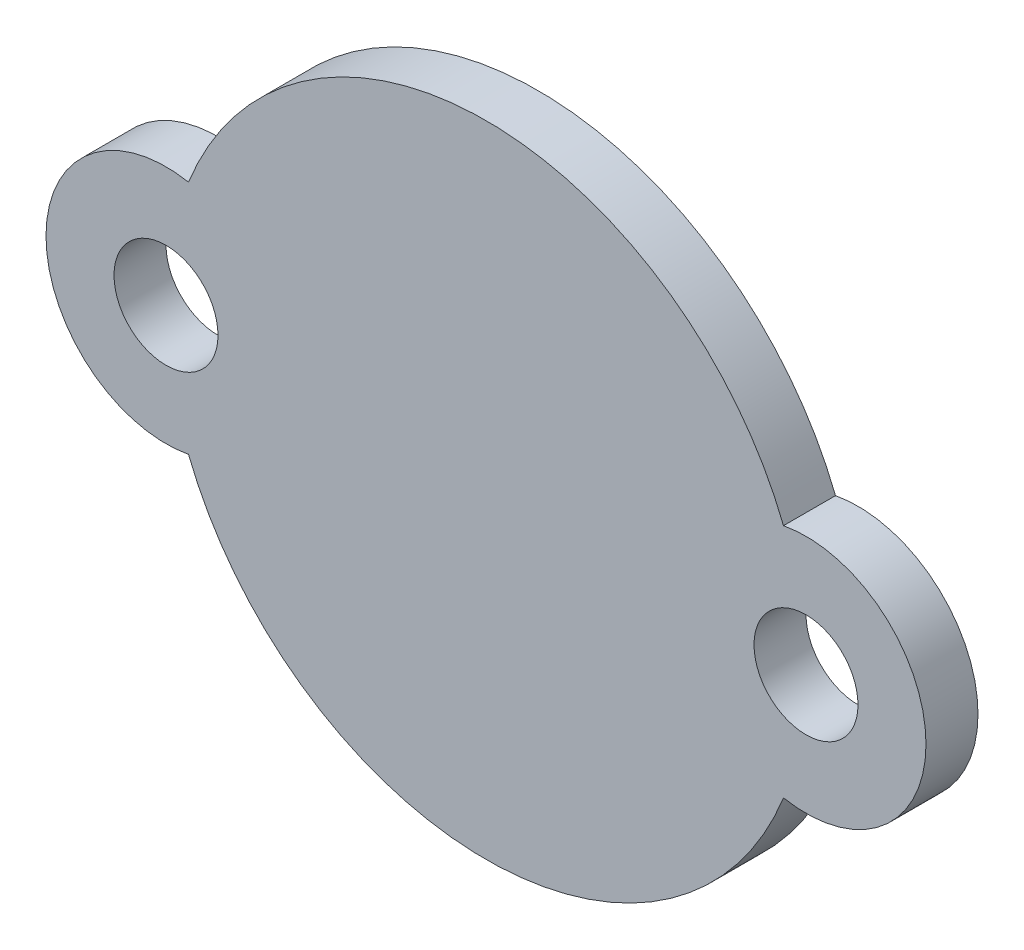
ISO-10303-21;
HEADER;
FILE_DESCRIPTION(('STEP AP214'),'2;1');
FILE_NAME('part.step','',(''),(''),'','','');
FILE_SCHEMA(('AUTOMOTIVE_DESIGN { 1 0 10303 214 1 1 1 1 }'));
ENDSEC;
DATA;
#1=APPLICATION_CONTEXT('core data for automotive mechanical design processes');
#2=APPLICATION_PROTOCOL_DEFINITION('international standard','automotive_design',2000,#1);
#3=PRODUCT_CONTEXT('',#1,'mechanical');
#4=PRODUCT('Part','Part','',(#3));
#5=PRODUCT_RELATED_PRODUCT_CATEGORY('part','',(#4));
#6=PRODUCT_DEFINITION_FORMATION('','',#4);
#7=PRODUCT_DEFINITION_CONTEXT('part definition',#1,'design');
#8=PRODUCT_DEFINITION('design','',#6,#7);
#9=PRODUCT_DEFINITION_SHAPE('','',#8);
#10=(LENGTH_UNIT() NAMED_UNIT(*) SI_UNIT(.MILLI.,.METRE.));
#11=(NAMED_UNIT(*) PLANE_ANGLE_UNIT() SI_UNIT($,.RADIAN.));
#12=(NAMED_UNIT(*) SI_UNIT($,.STERADIAN.) SOLID_ANGLE_UNIT());
#13=UNCERTAINTY_MEASURE_WITH_UNIT(LENGTH_MEASURE(1.E-05),#10,'distance_accuracy_value','');
#14=(GEOMETRIC_REPRESENTATION_CONTEXT(3) GLOBAL_UNCERTAINTY_ASSIGNED_CONTEXT((#13)) GLOBAL_UNIT_ASSIGNED_CONTEXT((#10,
#11,#12)) REPRESENTATION_CONTEXT('',''));
#15=CARTESIAN_POINT('',(0.,0.,0.));
#16=DIRECTION('',(0.,0.,1.));
#17=DIRECTION('',(1.,0.,0.));
#18=AXIS2_PLACEMENT_3D('',#15,#16,#17);
#19=CARTESIAN_POINT('',(0.,0.,10.));
#20=DIRECTION('',(0.,0.,-1.));
#21=DIRECTION('',(-1.,0.,0.));
#22=AXIS2_PLACEMENT_3D('',#19,#20,#21);
#23=CYLINDRICAL_SURFACE('',#22,8.);
#24=DIRECTION('',(0.,0.,-1.));
#25=VECTOR('',#24,1.);
#26=CARTESIAN_POINT('',(7.4375,-2.94679380853157,10.));
#27=LINE('',#26,#25);
#28=CARTESIAN_POINT('',(7.4375,-2.94679380853157,0.3));
#29=VERTEX_POINT('',#28);
#30=CARTESIAN_POINT('',(7.4375,-2.94679380853157,-1.));
#31=VERTEX_POINT('',#30);
#32=EDGE_CURVE('E11',#29,#31,#27,.T.);
#33=ORIENTED_EDGE('',*,*,#32,.F.);
#34=CARTESIAN_POINT('',(0.,0.,0.3));
#35=DIRECTION('',(0.,0.,1.));
#36=DIRECTION('',(1.,0.,0.));
#37=AXIS2_PLACEMENT_3D('',#34,#35,#36);
#38=CIRCLE('',#37,8.);
#39=CARTESIAN_POINT('',(-7.4375,-2.94679380853157,0.3));
#40=VERTEX_POINT('',#39);
#41=EDGE_CURVE('E84',#40,#29,#38,.T.);
#42=ORIENTED_EDGE('',*,*,#41,.F.);
#43=DIRECTION('',(0.,0.,-1.));
#44=VECTOR('',#43,1.);
#45=CARTESIAN_POINT('',(-7.4375,-2.94679380853157,10.));
#46=LINE('',#45,#44);
#47=CARTESIAN_POINT('',(-7.4375,-2.94679380853157,-1.));
#48=VERTEX_POINT('',#47);
#49=EDGE_CURVE('E62',#40,#48,#46,.T.);
#50=ORIENTED_EDGE('',*,*,#49,.T.);
#51=CARTESIAN_POINT('',(0.,0.,-1.));
#52=DIRECTION('',(0.,0.,-1.));
#53=DIRECTION('',(-1.,0.,0.));
#54=AXIS2_PLACEMENT_3D('',#51,#52,#53);
#55=CIRCLE('',#54,8.);
#56=EDGE_CURVE('E116',#31,#48,#55,.T.);
#57=ORIENTED_EDGE('',*,*,#56,.F.);
#58=EDGE_LOOP('',(#33,#42,#50,#57));
#59=FACE_BOUND('',#58,.T.);
#60=ADVANCED_FACE('F39',(#59),#23,.T.);
#61=CARTESIAN_POINT('',(8.,0.,10.));
#62=DIRECTION('',(0.,0.,-1.));
#63=DIRECTION('',(-1.,0.,0.));
#64=AXIS2_PLACEMENT_3D('',#61,#62,#63);
#65=CYLINDRICAL_SURFACE('',#64,1.3);
#66=CARTESIAN_POINT('',(8.,0.,-1.));
#67=DIRECTION('',(0.,0.,-1.));
#68=DIRECTION('',(-1.,0.,0.));
#69=AXIS2_PLACEMENT_3D('',#66,#67,#68);
#70=CIRCLE('',#69,1.3);
#71=CARTESIAN_POINT('',(6.7,0.,-1.));
#72=VERTEX_POINT('',#71);
#73=EDGE_CURVE('E104',#72,#72,#70,.T.);
#74=ORIENTED_EDGE('',*,*,#73,.T.);
#75=EDGE_LOOP('',(#74));
#76=FACE_BOUND('',#75,.T.);
#77=CARTESIAN_POINT('',(8.,0.,0.3));
#78=DIRECTION('',(0.,0.,1.));
#79=DIRECTION('',(1.,0.,0.));
#80=AXIS2_PLACEMENT_3D('',#77,#78,#79);
#81=CIRCLE('',#80,1.3);
#82=CARTESIAN_POINT('',(9.3,0.,0.3));
#83=VERTEX_POINT('',#82);
#84=EDGE_CURVE('E95',#83,#83,#81,.T.);
#85=ORIENTED_EDGE('',*,*,#84,.T.);
#86=EDGE_LOOP('',(#85));
#87=FACE_BOUND('',#86,.T.);
#88=ADVANCED_FACE('F132',(#76,#87),#65,.F.);
#89=CARTESIAN_POINT('',(-8.,0.,10.));
#90=DIRECTION('',(0.,0.,-1.));
#91=DIRECTION('',(-1.,0.,0.));
#92=AXIS2_PLACEMENT_3D('',#89,#90,#91);
#93=CYLINDRICAL_SURFACE('',#92,1.3);
#94=CARTESIAN_POINT('',(-8.,0.,-1.));
#95=DIRECTION('',(0.,0.,-1.));
#96=DIRECTION('',(-1.,0.,0.));
#97=AXIS2_PLACEMENT_3D('',#94,#95,#96);
#98=CIRCLE('',#97,1.3);
#99=CARTESIAN_POINT('',(-9.3,0.,-1.));
#100=VERTEX_POINT('',#99);
#101=EDGE_CURVE('E107',#100,#100,#98,.T.);
#102=ORIENTED_EDGE('',*,*,#101,.T.);
#103=EDGE_LOOP('',(#102));
#104=FACE_BOUND('',#103,.T.);
#105=CARTESIAN_POINT('',(-8.,0.,0.3));
#106=DIRECTION('',(0.,0.,1.));
#107=DIRECTION('',(1.,0.,0.));
#108=AXIS2_PLACEMENT_3D('',#105,#106,#107);
#109=CIRCLE('',#108,1.3);
#110=CARTESIAN_POINT('',(-6.7,0.,0.3));
#111=VERTEX_POINT('',#110);
#112=EDGE_CURVE('E98',#111,#111,#109,.T.);
#113=ORIENTED_EDGE('',*,*,#112,.T.);
#114=EDGE_LOOP('',(#113));
#115=FACE_BOUND('',#114,.T.);
#116=ADVANCED_FACE('F135',(#104,#115),#93,.F.);
#117=CARTESIAN_POINT('',(8.,0.,10.));
#118=DIRECTION('',(0.,0.,-1.));
#119=DIRECTION('',(-1.,0.,0.));
#120=AXIS2_PLACEMENT_3D('',#117,#118,#119);
#121=CYLINDRICAL_SURFACE('',#120,3.);
#122=DIRECTION('',(0.,0.,-1.));
#123=VECTOR('',#122,1.);
#124=CARTESIAN_POINT('',(7.4375,2.94679380853157,10.));
#125=LINE('',#124,#123);
#126=CARTESIAN_POINT('',(7.4375,2.94679380853157,0.3));
#127=VERTEX_POINT('',#126);
#128=CARTESIAN_POINT('',(7.4375,2.94679380853157,-1.));
#129=VERTEX_POINT('',#128);
#130=EDGE_CURVE('E47',#127,#129,#125,.T.);
#131=ORIENTED_EDGE('',*,*,#130,.F.);
#132=CARTESIAN_POINT('',(8.,0.,0.3));
#133=DIRECTION('',(0.,0.,1.));
#134=DIRECTION('',(1.,0.,0.));
#135=AXIS2_PLACEMENT_3D('',#132,#133,#134);
#136=CIRCLE('',#135,3.);
#137=EDGE_CURVE('E88',#29,#127,#136,.T.);
#138=ORIENTED_EDGE('',*,*,#137,.F.);
#139=ORIENTED_EDGE('',*,*,#32,.T.);
#140=CARTESIAN_POINT('',(8.,0.,-1.));
#141=DIRECTION('',(0.,0.,-1.));
#142=DIRECTION('',(-1.,0.,0.));
#143=AXIS2_PLACEMENT_3D('',#140,#141,#142);
#144=CIRCLE('',#143,3.);
#145=EDGE_CURVE('E113',#129,#31,#144,.T.);
#146=ORIENTED_EDGE('',*,*,#145,.F.);
#147=EDGE_LOOP('',(#131,#138,#139,#146));
#148=FACE_BOUND('',#147,.T.);
#149=ADVANCED_FACE('F41',(#148),#121,.T.);
#150=CARTESIAN_POINT('',(-8.,0.,10.));
#151=DIRECTION('',(0.,0.,-1.));
#152=DIRECTION('',(-1.,0.,0.));
#153=AXIS2_PLACEMENT_3D('',#150,#151,#152);
#154=CYLINDRICAL_SURFACE('',#153,3.);
#155=ORIENTED_EDGE('',*,*,#49,.F.);
#156=CARTESIAN_POINT('',(-8.,0.,0.3));
#157=DIRECTION('',(0.,0.,1.));
#158=DIRECTION('',(1.,0.,0.));
#159=AXIS2_PLACEMENT_3D('',#156,#157,#158);
#160=CIRCLE('',#159,3.);
#161=CARTESIAN_POINT('',(-7.4375,2.94679380853157,0.3));
#162=VERTEX_POINT('',#161);
#163=EDGE_CURVE('E80',#162,#40,#160,.T.);
#164=ORIENTED_EDGE('',*,*,#163,.F.);
#165=DIRECTION('',(0.,0.,-1.));
#166=VECTOR('',#165,1.);
#167=CARTESIAN_POINT('',(-7.4375,2.94679380853157,10.));
#168=LINE('',#167,#166);
#169=CARTESIAN_POINT('',(-7.4375,2.94679380853157,-1.));
#170=VERTEX_POINT('',#169);
#171=EDGE_CURVE('E54',#162,#170,#168,.T.);
#172=ORIENTED_EDGE('',*,*,#171,.T.);
#173=CARTESIAN_POINT('',(-8.,0.,-1.));
#174=DIRECTION('',(0.,0.,-1.));
#175=DIRECTION('',(-1.,0.,0.));
#176=AXIS2_PLACEMENT_3D('',#173,#174,#175);
#177=CIRCLE('',#176,3.);
#178=EDGE_CURVE('E81',#48,#170,#177,.T.);
#179=ORIENTED_EDGE('',*,*,#178,.F.);
#180=EDGE_LOOP('',(#155,#164,#172,#179));
#181=FACE_BOUND('',#180,.T.);
#182=ADVANCED_FACE('F78',(#181),#154,.T.);
#183=ORIENTED_EDGE('',*,*,#171,.F.);
#184=CARTESIAN_POINT('',(0.,0.,0.3));
#185=DIRECTION('',(0.,0.,1.));
#186=DIRECTION('',(1.,0.,0.));
#187=AXIS2_PLACEMENT_3D('',#184,#185,#186);
#188=CIRCLE('',#187,8.);
#189=EDGE_CURVE('E94',#127,#162,#188,.T.);
#190=ORIENTED_EDGE('',*,*,#189,.F.);
#191=ORIENTED_EDGE('',*,*,#130,.T.);
#192=CARTESIAN_POINT('',(0.,0.,-1.));
#193=DIRECTION('',(0.,0.,-1.));
#194=DIRECTION('',(-1.,0.,0.));
#195=AXIS2_PLACEMENT_3D('',#192,#193,#194);
#196=CIRCLE('',#195,8.);
#197=EDGE_CURVE('E110',#170,#129,#196,.T.);
#198=ORIENTED_EDGE('',*,*,#197,.F.);
#199=EDGE_LOOP('',(#183,#190,#191,#198));
#200=FACE_BOUND('',#199,.T.);
#201=ADVANCED_FACE('F122',(#200),#23,.T.);
#202=CARTESIAN_POINT('',(4.,0.,-1.));
#203=DIRECTION('',(0.,0.,-1.));
#204=DIRECTION('',(-1.,0.,0.));
#205=AXIS2_PLACEMENT_3D('',#202,#203,#204);
#206=PLANE('',#205);
#207=ORIENTED_EDGE('',*,*,#101,.F.);
#208=EDGE_LOOP('',(#207));
#209=FACE_BOUND('',#208,.T.);
#210=ORIENTED_EDGE('',*,*,#197,.T.);
#211=ORIENTED_EDGE('',*,*,#145,.T.);
#212=ORIENTED_EDGE('',*,*,#56,.T.);
#213=ORIENTED_EDGE('',*,*,#178,.T.);
#214=EDGE_LOOP('',(#210,#211,#212,#213));
#215=FACE_BOUND('',#214,.T.);
#216=ORIENTED_EDGE('',*,*,#73,.F.);
#217=EDGE_LOOP('',(#216));
#218=FACE_BOUND('',#217,.T.);
#219=ADVANCED_FACE('F125',(#209,#215,#218),#206,.T.);
#220=CARTESIAN_POINT('',(-4.,0.,0.3));
#221=DIRECTION('',(0.,0.,1.));
#222=DIRECTION('',(1.,0.,0.));
#223=AXIS2_PLACEMENT_3D('',#220,#221,#222);
#224=PLANE('',#223);
#225=ORIENTED_EDGE('',*,*,#84,.F.);
#226=EDGE_LOOP('',(#225));
#227=FACE_BOUND('',#226,.T.);
#228=ORIENTED_EDGE('',*,*,#163,.T.);
#229=ORIENTED_EDGE('',*,*,#41,.T.);
#230=ORIENTED_EDGE('',*,*,#137,.T.);
#231=ORIENTED_EDGE('',*,*,#189,.T.);
#232=EDGE_LOOP('',(#228,#229,#230,#231));
#233=FACE_BOUND('',#232,.T.);
#234=ORIENTED_EDGE('',*,*,#112,.F.);
#235=EDGE_LOOP('',(#234));
#236=FACE_BOUND('',#235,.T.);
#237=ADVANCED_FACE('F91',(#227,#233,#236),#224,.T.);
#238=CLOSED_SHELL('',(#60,#88,#116,#149,#182,#201,#219,#237));
#239=MANIFOLD_SOLID_BREP('B2',#238);
#240=ADVANCED_BREP_SHAPE_REPRESENTATION('',(#18,#239),#14);
#241=SHAPE_DEFINITION_REPRESENTATION(#9,#240);
ENDSEC;
END-ISO-10303-21;
